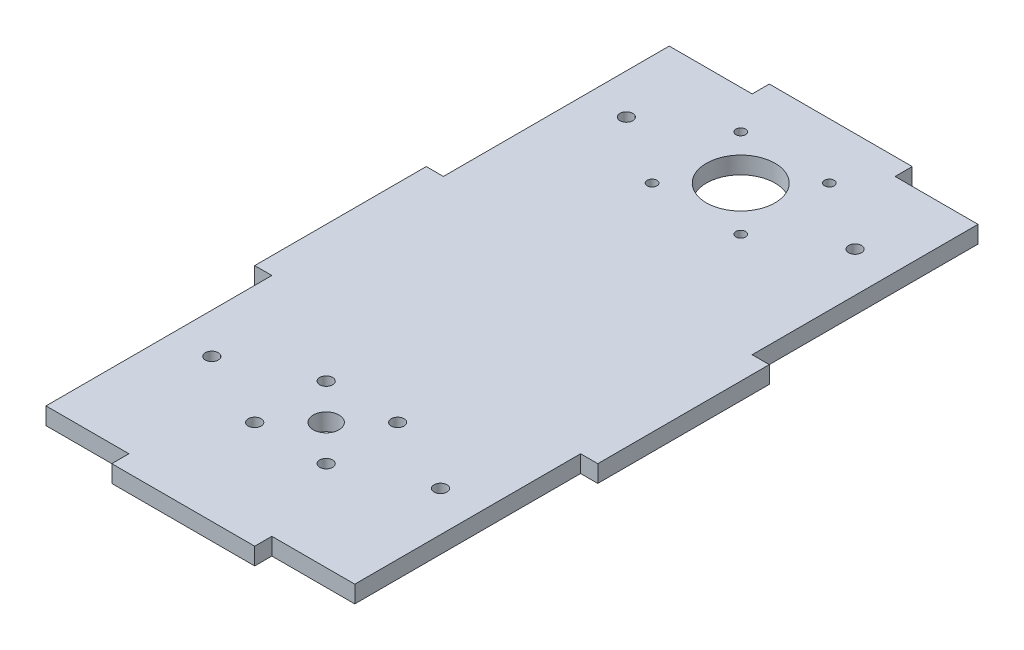
ISO-10303-21;
HEADER;
FILE_DESCRIPTION(('STEP AP214'),'2;1');
FILE_NAME('part.step','',(''),(''),'','','');
FILE_SCHEMA(('AUTOMOTIVE_DESIGN { 1 0 10303 214 1 1 1 1 }'));
ENDSEC;
DATA;
#1=APPLICATION_CONTEXT('core data for automotive mechanical design processes');
#2=APPLICATION_PROTOCOL_DEFINITION('international standard','automotive_design',2000,#1);
#3=PRODUCT_CONTEXT('',#1,'mechanical');
#4=PRODUCT('Part','Part','',(#3));
#5=PRODUCT_RELATED_PRODUCT_CATEGORY('part','',(#4));
#6=PRODUCT_DEFINITION_FORMATION('','',#4);
#7=PRODUCT_DEFINITION_CONTEXT('part definition',#1,'design');
#8=PRODUCT_DEFINITION('design','',#6,#7);
#9=PRODUCT_DEFINITION_SHAPE('','',#8);
#10=(LENGTH_UNIT() NAMED_UNIT(*) SI_UNIT(.MILLI.,.METRE.));
#11=(NAMED_UNIT(*) PLANE_ANGLE_UNIT() SI_UNIT($,.RADIAN.));
#12=(NAMED_UNIT(*) SI_UNIT($,.STERADIAN.) SOLID_ANGLE_UNIT());
#13=UNCERTAINTY_MEASURE_WITH_UNIT(LENGTH_MEASURE(1.E-05),#10,'distance_accuracy_value','');
#14=(GEOMETRIC_REPRESENTATION_CONTEXT(3) GLOBAL_UNCERTAINTY_ASSIGNED_CONTEXT((#13)) GLOBAL_UNIT_ASSIGNED_CONTEXT((#10,
#11,#12)) REPRESENTATION_CONTEXT('',''));
#15=CARTESIAN_POINT('',(0.,0.,0.));
#16=DIRECTION('',(0.,0.,1.));
#17=DIRECTION('',(1.,0.,0.));
#18=AXIS2_PLACEMENT_3D('',#15,#16,#17);
#19=CARTESIAN_POINT('',(0.,-3.,0.));
#20=DIRECTION('',(0.,1.,0.));
#21=DIRECTION('',(0.,0.,1.));
#22=AXIS2_PLACEMENT_3D('',#19,#20,#21);
#23=PLANE('',#22);
#24=CARTESIAN_POINT('',(-40.,-3.,-80.));
#25=DIRECTION('',(0.,1.,0.));
#26=DIRECTION('',(0.,0.,1.));
#27=AXIS2_PLACEMENT_3D('',#24,#25,#26);
#28=CIRCLE('',#27,2.25);
#29=CARTESIAN_POINT('',(-40.,-3.,-77.75));
#30=VERTEX_POINT('',#29);
#31=EDGE_CURVE('E454',#30,#30,#28,.T.);
#32=ORIENTED_EDGE('',*,*,#31,.T.);
#33=EDGE_LOOP('',(#32));
#34=FACE_BOUND('',#33,.T.);
#35=CARTESIAN_POINT('',(-40.,-3.,65.));
#36=DIRECTION('',(0.,1.,0.));
#37=DIRECTION('',(0.,0.,1.));
#38=AXIS2_PLACEMENT_3D('',#35,#36,#37);
#39=CIRCLE('',#38,2.25);
#40=CARTESIAN_POINT('',(-40.,-3.,67.25));
#41=VERTEX_POINT('',#40);
#42=EDGE_CURVE('E459',#41,#41,#39,.T.);
#43=ORIENTED_EDGE('',*,*,#42,.T.);
#44=EDGE_LOOP('',(#43));
#45=FACE_BOUND('',#44,.T.);
#46=CARTESIAN_POINT('',(40.,-3.,65.));
#47=DIRECTION('',(0.,1.,0.));
#48=DIRECTION('',(0.,0.,1.));
#49=AXIS2_PLACEMENT_3D('',#46,#47,#48);
#50=CIRCLE('',#49,2.25);
#51=CARTESIAN_POINT('',(40.,-3.,67.25));
#52=VERTEX_POINT('',#51);
#53=EDGE_CURVE('E465',#52,#52,#50,.T.);
#54=ORIENTED_EDGE('',*,*,#53,.T.);
#55=EDGE_LOOP('',(#54));
#56=FACE_BOUND('',#55,.T.);
#57=CARTESIAN_POINT('',(40.,-3.,-80.));
#58=DIRECTION('',(0.,1.,0.));
#59=DIRECTION('',(0.,0.,1.));
#60=AXIS2_PLACEMENT_3D('',#57,#58,#59);
#61=CIRCLE('',#60,2.25);
#62=CARTESIAN_POINT('',(40.,-3.,-77.75));
#63=VERTEX_POINT('',#62);
#64=EDGE_CURVE('E471',#63,#63,#61,.T.);
#65=ORIENTED_EDGE('',*,*,#64,.T.);
#66=EDGE_LOOP('',(#65));
#67=FACE_BOUND('',#66,.T.);
#68=CARTESIAN_POINT('',(-12.5,-3.,77.5));
#69=DIRECTION('',(0.,1.,0.));
#70=DIRECTION('',(0.,0.,1.));
#71=AXIS2_PLACEMENT_3D('',#68,#69,#70);
#72=CIRCLE('',#71,2.25);
#73=CARTESIAN_POINT('',(-12.5,-3.,79.75));
#74=VERTEX_POINT('',#73);
#75=EDGE_CURVE('E477',#74,#74,#72,.T.);
#76=ORIENTED_EDGE('',*,*,#75,.T.);
#77=EDGE_LOOP('',(#76));
#78=FACE_BOUND('',#77,.T.);
#79=CARTESIAN_POINT('',(-12.5,-3.,52.5));
#80=DIRECTION('',(0.,1.,0.));
#81=DIRECTION('',(0.,0.,1.));
#82=AXIS2_PLACEMENT_3D('',#79,#80,#81);
#83=CIRCLE('',#82,2.25);
#84=CARTESIAN_POINT('',(-12.5,-3.,54.75));
#85=VERTEX_POINT('',#84);
#86=EDGE_CURVE('E483',#85,#85,#83,.T.);
#87=ORIENTED_EDGE('',*,*,#86,.T.);
#88=EDGE_LOOP('',(#87));
#89=FACE_BOUND('',#88,.T.);
#90=CARTESIAN_POINT('',(12.5,-3.,52.5));
#91=DIRECTION('',(0.,1.,0.));
#92=DIRECTION('',(0.,0.,1.));
#93=AXIS2_PLACEMENT_3D('',#90,#91,#92);
#94=CIRCLE('',#93,2.25);
#95=CARTESIAN_POINT('',(12.5,-3.,54.75));
#96=VERTEX_POINT('',#95);
#97=EDGE_CURVE('E489',#96,#96,#94,.T.);
#98=ORIENTED_EDGE('',*,*,#97,.T.);
#99=EDGE_LOOP('',(#98));
#100=FACE_BOUND('',#99,.T.);
#101=CARTESIAN_POINT('',(12.5,-3.,77.5));
#102=DIRECTION('',(0.,1.,0.));
#103=DIRECTION('',(0.,0.,1.));
#104=AXIS2_PLACEMENT_3D('',#101,#102,#103);
#105=CIRCLE('',#104,2.25);
#106=CARTESIAN_POINT('',(12.5,-3.,79.75));
#107=VERTEX_POINT('',#106);
#108=EDGE_CURVE('E495',#107,#107,#105,.T.);
#109=ORIENTED_EDGE('',*,*,#108,.T.);
#110=EDGE_LOOP('',(#109));
#111=FACE_BOUND('',#110,.T.);
#112=DIRECTION('',(-1.,0.,0.));
#113=VECTOR('',#112,1.);
#114=CARTESIAN_POINT('',(25.,-3.,-109.));
#115=LINE('',#114,#113);
#116=CARTESIAN_POINT('',(54.,-3.,-109.));
#117=VERTEX_POINT('',#116);
#118=CARTESIAN_POINT('',(25.,-3.,-109.));
#119=VERTEX_POINT('',#118);
#120=EDGE_CURVE('E202',#117,#119,#115,.T.);
#121=ORIENTED_EDGE('',*,*,#120,.F.);
#122=DIRECTION('',(0.,0.,-1.));
#123=VECTOR('',#122,1.);
#124=CARTESIAN_POINT('',(54.,-3.,-30.));
#125=LINE('',#124,#123);
#126=CARTESIAN_POINT('',(54.,-3.,-30.));
#127=VERTEX_POINT('',#126);
#128=EDGE_CURVE('E120',#127,#117,#125,.T.);
#129=ORIENTED_EDGE('',*,*,#128,.F.);
#130=DIRECTION('',(-1.,0.,0.));
#131=VECTOR('',#130,1.);
#132=CARTESIAN_POINT('',(54.,-3.,-30.));
#133=LINE('',#132,#131);
#134=CARTESIAN_POINT('',(60.,-3.,-30.));
#135=VERTEX_POINT('',#134);
#136=EDGE_CURVE('E114',#135,#127,#133,.T.);
#137=ORIENTED_EDGE('',*,*,#136,.F.);
#138=DIRECTION('',(0.,0.,-1.));
#139=VECTOR('',#138,1.);
#140=CARTESIAN_POINT('',(60.,-3.,-30.));
#141=LINE('',#140,#139);
#142=CARTESIAN_POINT('',(60.,-3.,30.));
#143=VERTEX_POINT('',#142);
#144=EDGE_CURVE('E192',#143,#135,#141,.T.);
#145=ORIENTED_EDGE('',*,*,#144,.F.);
#146=DIRECTION('',(1.,0.,0.));
#147=VECTOR('',#146,1.);
#148=CARTESIAN_POINT('',(54.,-3.,30.));
#149=LINE('',#148,#147);
#150=CARTESIAN_POINT('',(54.,-3.,30.));
#151=VERTEX_POINT('',#150);
#152=EDGE_CURVE('E236',#151,#143,#149,.T.);
#153=ORIENTED_EDGE('',*,*,#152,.F.);
#154=DIRECTION('',(0.,0.,-1.));
#155=VECTOR('',#154,1.);
#156=CARTESIAN_POINT('',(54.,-3.,109.));
#157=LINE('',#156,#155);
#158=CARTESIAN_POINT('',(54.,-3.,109.));
#159=VERTEX_POINT('',#158);
#160=EDGE_CURVE('E234',#159,#151,#157,.T.);
#161=ORIENTED_EDGE('',*,*,#160,.F.);
#162=DIRECTION('',(1.,0.,0.));
#163=VECTOR('',#162,1.);
#164=CARTESIAN_POINT('',(25.,-3.,109.));
#165=LINE('',#164,#163);
#166=CARTESIAN_POINT('',(25.,-3.,109.));
#167=VERTEX_POINT('',#166);
#168=EDGE_CURVE('E232',#167,#159,#165,.T.);
#169=ORIENTED_EDGE('',*,*,#168,.F.);
#170=DIRECTION('',(0.,0.,-1.));
#171=VECTOR('',#170,1.);
#172=CARTESIAN_POINT('',(25.,-3.,109.));
#173=LINE('',#172,#171);
#174=CARTESIAN_POINT('',(25.,-3.,115.));
#175=VERTEX_POINT('',#174);
#176=EDGE_CURVE('E230',#175,#167,#173,.T.);
#177=ORIENTED_EDGE('',*,*,#176,.F.);
#178=DIRECTION('',(1.,0.,0.));
#179=VECTOR('',#178,1.);
#180=CARTESIAN_POINT('',(-24.9999999999999,-3.,115.));
#181=LINE('',#180,#179);
#182=CARTESIAN_POINT('',(-24.9999999999999,-3.,115.));
#183=VERTEX_POINT('',#182);
#184=EDGE_CURVE('E228',#183,#175,#181,.T.);
#185=ORIENTED_EDGE('',*,*,#184,.F.);
#186=DIRECTION('',(0.,0.,1.));
#187=VECTOR('',#186,1.);
#188=CARTESIAN_POINT('',(-25.,-3.,109.));
#189=LINE('',#188,#187);
#190=CARTESIAN_POINT('',(-25.,-3.,109.));
#191=VERTEX_POINT('',#190);
#192=EDGE_CURVE('E226',#191,#183,#189,.T.);
#193=ORIENTED_EDGE('',*,*,#192,.F.);
#194=DIRECTION('',(1.,0.,0.));
#195=VECTOR('',#194,1.);
#196=CARTESIAN_POINT('',(-54.,-3.,109.));
#197=LINE('',#196,#195);
#198=CARTESIAN_POINT('',(-54.,-3.,109.));
#199=VERTEX_POINT('',#198);
#200=EDGE_CURVE('E224',#199,#191,#197,.T.);
#201=ORIENTED_EDGE('',*,*,#200,.F.);
#202=DIRECTION('',(0.,0.,1.));
#203=VECTOR('',#202,1.);
#204=CARTESIAN_POINT('',(-54.,-3.,109.));
#205=LINE('',#204,#203);
#206=CARTESIAN_POINT('',(-54.,-3.,30.));
#207=VERTEX_POINT('',#206);
#208=EDGE_CURVE('E222',#207,#199,#205,.T.);
#209=ORIENTED_EDGE('',*,*,#208,.F.);
#210=DIRECTION('',(1.,0.,0.));
#211=VECTOR('',#210,1.);
#212=CARTESIAN_POINT('',(-54.,-3.,30.));
#213=LINE('',#212,#211);
#214=CARTESIAN_POINT('',(-60.,-3.,30.));
#215=VERTEX_POINT('',#214);
#216=EDGE_CURVE('E220',#215,#207,#213,.T.);
#217=ORIENTED_EDGE('',*,*,#216,.F.);
#218=DIRECTION('',(0.,0.,1.));
#219=VECTOR('',#218,1.);
#220=CARTESIAN_POINT('',(-60.,-3.,-30.));
#221=LINE('',#220,#219);
#222=CARTESIAN_POINT('',(-60.,-3.,-30.));
#223=VERTEX_POINT('',#222);
#224=EDGE_CURVE('E218',#223,#215,#221,.T.);
#225=ORIENTED_EDGE('',*,*,#224,.F.);
#226=DIRECTION('',(-1.,0.,0.));
#227=VECTOR('',#226,1.);
#228=CARTESIAN_POINT('',(-54.,-3.,-30.));
#229=LINE('',#228,#227);
#230=CARTESIAN_POINT('',(-54.,-3.,-30.));
#231=VERTEX_POINT('',#230);
#232=EDGE_CURVE('E216',#231,#223,#229,.T.);
#233=ORIENTED_EDGE('',*,*,#232,.F.);
#234=DIRECTION('',(0.,0.,1.));
#235=VECTOR('',#234,1.);
#236=CARTESIAN_POINT('',(-54.,-3.,-30.));
#237=LINE('',#236,#235);
#238=CARTESIAN_POINT('',(-54.,-3.,-109.));
#239=VERTEX_POINT('',#238);
#240=EDGE_CURVE('E214',#239,#231,#237,.T.);
#241=ORIENTED_EDGE('',*,*,#240,.F.);
#242=DIRECTION('',(-1.,0.,0.));
#243=VECTOR('',#242,1.);
#244=CARTESIAN_POINT('',(-54.,-3.,-109.));
#245=LINE('',#244,#243);
#246=CARTESIAN_POINT('',(-25.,-3.,-109.));
#247=VERTEX_POINT('',#246);
#248=EDGE_CURVE('E212',#247,#239,#245,.T.);
#249=ORIENTED_EDGE('',*,*,#248,.F.);
#250=DIRECTION('',(0.,0.,1.));
#251=VECTOR('',#250,1.);
#252=CARTESIAN_POINT('',(-25.,-3.,-109.));
#253=LINE('',#252,#251);
#254=CARTESIAN_POINT('',(-25.,-3.,-115.));
#255=VERTEX_POINT('',#254);
#256=EDGE_CURVE('E210',#255,#247,#253,.T.);
#257=ORIENTED_EDGE('',*,*,#256,.F.);
#258=DIRECTION('',(-1.,0.,0.));
#259=VECTOR('',#258,1.);
#260=CARTESIAN_POINT('',(-25.,-3.,-115.));
#261=LINE('',#260,#259);
#262=CARTESIAN_POINT('',(25.,-3.,-115.));
#263=VERTEX_POINT('',#262);
#264=EDGE_CURVE('E208',#263,#255,#261,.T.);
#265=ORIENTED_EDGE('',*,*,#264,.F.);
#266=DIRECTION('',(0.,0.,-1.));
#267=VECTOR('',#266,1.);
#268=CARTESIAN_POINT('',(25.,-3.,-109.));
#269=LINE('',#268,#267);
#270=EDGE_CURVE('E205',#119,#263,#269,.T.);
#271=ORIENTED_EDGE('',*,*,#270,.F.);
#272=EDGE_LOOP('',(#121,#129,#137,#145,#153,#161,#169,#177,#185,#193,#201,#209,#217,#225,#233,
#241,#249,#257,#265,#271));
#273=FACE_BOUND('',#272,.T.);
#274=CARTESIAN_POINT('',(0.,-3.,65.));
#275=DIRECTION('',(0.,1.,0.));
#276=DIRECTION('',(0.,0.,1.));
#277=AXIS2_PLACEMENT_3D('',#274,#275,#276);
#278=CIRCLE('',#277,4.5);
#279=CARTESIAN_POINT('',(0.,-3.,69.5));
#280=VERTEX_POINT('',#279);
#281=EDGE_CURVE('E502',#280,#280,#278,.T.);
#282=ORIENTED_EDGE('',*,*,#281,.T.);
#283=EDGE_LOOP('',(#282));
#284=FACE_BOUND('',#283,.T.);
#285=CARTESIAN_POINT('',(0.,-3.,-80.));
#286=DIRECTION('',(0.,1.,0.));
#287=DIRECTION('',(0.,0.,1.));
#288=AXIS2_PLACEMENT_3D('',#285,#286,#287);
#289=CIRCLE('',#288,12.);
#290=CARTESIAN_POINT('',(0.,-3.,-68.));
#291=VERTEX_POINT('',#290);
#292=EDGE_CURVE('E498',#291,#291,#289,.T.);
#293=ORIENTED_EDGE('',*,*,#292,.T.);
#294=EDGE_LOOP('',(#293));
#295=FACE_BOUND('',#294,.T.);
#296=CARTESIAN_POINT('',(-15.5,-3.,-64.5));
#297=DIRECTION('',(0.,-1.,0.));
#298=DIRECTION('',(0.,0.,-1.));
#299=AXIS2_PLACEMENT_3D('',#296,#297,#298);
#300=CIRCLE('',#299,1.69999999999999);
#301=CARTESIAN_POINT('',(-15.5,-3.,-66.2));
#302=VERTEX_POINT('',#301);
#303=EDGE_CURVE('E445',#302,#302,#300,.T.);
#304=ORIENTED_EDGE('',*,*,#303,.F.);
#305=EDGE_LOOP('',(#304));
#306=FACE_BOUND('',#305,.T.);
#307=CARTESIAN_POINT('',(-15.5,-3.,-95.5));
#308=DIRECTION('',(0.,-1.,0.));
#309=DIRECTION('',(0.,0.,-1.));
#310=AXIS2_PLACEMENT_3D('',#307,#308,#309);
#311=CIRCLE('',#310,1.69999999999999);
#312=CARTESIAN_POINT('',(-15.5,-3.,-97.2));
#313=VERTEX_POINT('',#312);
#314=EDGE_CURVE('E439',#313,#313,#311,.T.);
#315=ORIENTED_EDGE('',*,*,#314,.F.);
#316=EDGE_LOOP('',(#315));
#317=FACE_BOUND('',#316,.T.);
#318=CARTESIAN_POINT('',(15.5,-3.,-95.5));
#319=DIRECTION('',(0.,-1.,0.));
#320=DIRECTION('',(0.,0.,-1.));
#321=AXIS2_PLACEMENT_3D('',#318,#319,#320);
#322=CIRCLE('',#321,1.69999999999999);
#323=CARTESIAN_POINT('',(15.5,-3.,-97.2));
#324=VERTEX_POINT('',#323);
#325=EDGE_CURVE('E430',#324,#324,#322,.T.);
#326=ORIENTED_EDGE('',*,*,#325,.F.);
#327=EDGE_LOOP('',(#326));
#328=FACE_BOUND('',#327,.T.);
#329=CARTESIAN_POINT('',(15.5,-3.,-64.5));
#330=DIRECTION('',(0.,-1.,0.));
#331=DIRECTION('',(0.,0.,-1.));
#332=AXIS2_PLACEMENT_3D('',#329,#330,#331);
#333=CIRCLE('',#332,1.69999999999999);
#334=CARTESIAN_POINT('',(15.5,-3.,-66.2));
#335=VERTEX_POINT('',#334);
#336=EDGE_CURVE('E426',#335,#335,#333,.T.);
#337=ORIENTED_EDGE('',*,*,#336,.F.);
#338=EDGE_LOOP('',(#337));
#339=FACE_BOUND('',#338,.T.);
#340=ADVANCED_FACE('F32',(#34,#45,#56,#67,#78,#89,#100,#111,#273,#284,#295,#306,#317,#328,#339),
#23,.F.);
#341=CARTESIAN_POINT('',(0.,3.,0.));
#342=DIRECTION('',(0.,1.,0.));
#343=DIRECTION('',(0.,0.,1.));
#344=AXIS2_PLACEMENT_3D('',#341,#342,#343);
#345=PLANE('',#344);
#346=CARTESIAN_POINT('',(15.5,3.,-64.5));
#347=DIRECTION('',(0.,1.,0.));
#348=DIRECTION('',(0.,0.,1.));
#349=AXIS2_PLACEMENT_3D('',#346,#347,#348);
#350=CIRCLE('',#349,1.69999999999999);
#351=CARTESIAN_POINT('',(15.5,3.,-62.8));
#352=VERTEX_POINT('',#351);
#353=EDGE_CURVE('E429',#352,#352,#350,.T.);
#354=ORIENTED_EDGE('',*,*,#353,.F.);
#355=EDGE_LOOP('',(#354));
#356=FACE_BOUND('',#355,.T.);
#357=CARTESIAN_POINT('',(15.5,3.,-95.5));
#358=DIRECTION('',(0.,1.,0.));
#359=DIRECTION('',(0.,0.,1.));
#360=AXIS2_PLACEMENT_3D('',#357,#358,#359);
#361=CIRCLE('',#360,1.69999999999999);
#362=CARTESIAN_POINT('',(15.5,3.,-93.8));
#363=VERTEX_POINT('',#362);
#364=EDGE_CURVE('E433',#363,#363,#361,.T.);
#365=ORIENTED_EDGE('',*,*,#364,.F.);
#366=EDGE_LOOP('',(#365));
#367=FACE_BOUND('',#366,.T.);
#368=CARTESIAN_POINT('',(-15.5,3.,-95.5));
#369=DIRECTION('',(0.,1.,0.));
#370=DIRECTION('',(0.,0.,1.));
#371=AXIS2_PLACEMENT_3D('',#368,#369,#370);
#372=CIRCLE('',#371,1.69999999999999);
#373=CARTESIAN_POINT('',(-15.5,3.,-93.8));
#374=VERTEX_POINT('',#373);
#375=EDGE_CURVE('E442',#374,#374,#372,.T.);
#376=ORIENTED_EDGE('',*,*,#375,.F.);
#377=EDGE_LOOP('',(#376));
#378=FACE_BOUND('',#377,.T.);
#379=CARTESIAN_POINT('',(-15.5,3.,-64.5));
#380=DIRECTION('',(0.,1.,0.));
#381=DIRECTION('',(0.,0.,1.));
#382=AXIS2_PLACEMENT_3D('',#379,#380,#381);
#383=CIRCLE('',#382,1.69999999999999);
#384=CARTESIAN_POINT('',(-15.5,3.,-62.8));
#385=VERTEX_POINT('',#384);
#386=EDGE_CURVE('E448',#385,#385,#383,.T.);
#387=ORIENTED_EDGE('',*,*,#386,.F.);
#388=EDGE_LOOP('',(#387));
#389=FACE_BOUND('',#388,.T.);
#390=CARTESIAN_POINT('',(-40.,3.,-80.));
#391=DIRECTION('',(0.,1.,0.));
#392=DIRECTION('',(0.,0.,1.));
#393=AXIS2_PLACEMENT_3D('',#390,#391,#392);
#394=CIRCLE('',#393,2.25);
#395=CARTESIAN_POINT('',(-40.,3.,-77.75));
#396=VERTEX_POINT('',#395);
#397=EDGE_CURVE('E451',#396,#396,#394,.T.);
#398=ORIENTED_EDGE('',*,*,#397,.F.);
#399=EDGE_LOOP('',(#398));
#400=FACE_BOUND('',#399,.T.);
#401=CARTESIAN_POINT('',(-40.,3.,65.));
#402=DIRECTION('',(0.,1.,0.));
#403=DIRECTION('',(0.,0.,1.));
#404=AXIS2_PLACEMENT_3D('',#401,#402,#403);
#405=CIRCLE('',#404,2.25);
#406=CARTESIAN_POINT('',(-40.,3.,67.25));
#407=VERTEX_POINT('',#406);
#408=EDGE_CURVE('E456',#407,#407,#405,.T.);
#409=ORIENTED_EDGE('',*,*,#408,.F.);
#410=EDGE_LOOP('',(#409));
#411=FACE_BOUND('',#410,.T.);
#412=CARTESIAN_POINT('',(40.,3.,65.));
#413=DIRECTION('',(0.,1.,0.));
#414=DIRECTION('',(0.,0.,1.));
#415=AXIS2_PLACEMENT_3D('',#412,#413,#414);
#416=CIRCLE('',#415,2.25);
#417=CARTESIAN_POINT('',(40.,3.,67.25));
#418=VERTEX_POINT('',#417);
#419=EDGE_CURVE('E462',#418,#418,#416,.T.);
#420=ORIENTED_EDGE('',*,*,#419,.F.);
#421=EDGE_LOOP('',(#420));
#422=FACE_BOUND('',#421,.T.);
#423=CARTESIAN_POINT('',(40.,3.,-80.));
#424=DIRECTION('',(0.,1.,0.));
#425=DIRECTION('',(0.,0.,1.));
#426=AXIS2_PLACEMENT_3D('',#423,#424,#425);
#427=CIRCLE('',#426,2.25);
#428=CARTESIAN_POINT('',(40.,3.,-77.75));
#429=VERTEX_POINT('',#428);
#430=EDGE_CURVE('E468',#429,#429,#427,.T.);
#431=ORIENTED_EDGE('',*,*,#430,.F.);
#432=EDGE_LOOP('',(#431));
#433=FACE_BOUND('',#432,.T.);
#434=CARTESIAN_POINT('',(-12.5,3.,77.5));
#435=DIRECTION('',(0.,1.,0.));
#436=DIRECTION('',(0.,0.,1.));
#437=AXIS2_PLACEMENT_3D('',#434,#435,#436);
#438=CIRCLE('',#437,2.25);
#439=CARTESIAN_POINT('',(-12.5,3.,79.75));
#440=VERTEX_POINT('',#439);
#441=EDGE_CURVE('E474',#440,#440,#438,.T.);
#442=ORIENTED_EDGE('',*,*,#441,.F.);
#443=EDGE_LOOP('',(#442));
#444=FACE_BOUND('',#443,.T.);
#445=CARTESIAN_POINT('',(-12.5,3.,52.5));
#446=DIRECTION('',(0.,1.,0.));
#447=DIRECTION('',(0.,0.,1.));
#448=AXIS2_PLACEMENT_3D('',#445,#446,#447);
#449=CIRCLE('',#448,2.25);
#450=CARTESIAN_POINT('',(-12.5,3.,54.75));
#451=VERTEX_POINT('',#450);
#452=EDGE_CURVE('E480',#451,#451,#449,.T.);
#453=ORIENTED_EDGE('',*,*,#452,.F.);
#454=EDGE_LOOP('',(#453));
#455=FACE_BOUND('',#454,.T.);
#456=CARTESIAN_POINT('',(12.5,3.,52.5));
#457=DIRECTION('',(0.,1.,0.));
#458=DIRECTION('',(0.,0.,1.));
#459=AXIS2_PLACEMENT_3D('',#456,#457,#458);
#460=CIRCLE('',#459,2.25);
#461=CARTESIAN_POINT('',(12.5,3.,54.75));
#462=VERTEX_POINT('',#461);
#463=EDGE_CURVE('E486',#462,#462,#460,.T.);
#464=ORIENTED_EDGE('',*,*,#463,.F.);
#465=EDGE_LOOP('',(#464));
#466=FACE_BOUND('',#465,.T.);
#467=CARTESIAN_POINT('',(12.5,3.,77.5));
#468=DIRECTION('',(0.,1.,0.));
#469=DIRECTION('',(0.,0.,1.));
#470=AXIS2_PLACEMENT_3D('',#467,#468,#469);
#471=CIRCLE('',#470,2.25);
#472=CARTESIAN_POINT('',(12.5,3.,79.75));
#473=VERTEX_POINT('',#472);
#474=EDGE_CURVE('E492',#473,#473,#471,.T.);
#475=ORIENTED_EDGE('',*,*,#474,.F.);
#476=EDGE_LOOP('',(#475));
#477=FACE_BOUND('',#476,.T.);
#478=CARTESIAN_POINT('',(0.,3.,65.));
#479=DIRECTION('',(0.,1.,0.));
#480=DIRECTION('',(0.,0.,1.));
#481=AXIS2_PLACEMENT_3D('',#478,#479,#480);
#482=CIRCLE('',#481,4.5);
#483=CARTESIAN_POINT('',(0.,3.,69.5));
#484=VERTEX_POINT('',#483);
#485=EDGE_CURVE('E206',#484,#484,#482,.T.);
#486=ORIENTED_EDGE('',*,*,#485,.F.);
#487=EDGE_LOOP('',(#486));
#488=FACE_BOUND('',#487,.T.);
#489=DIRECTION('',(-1.,0.,0.));
#490=VECTOR('',#489,1.);
#491=CARTESIAN_POINT('',(25.,3.,-109.));
#492=LINE('',#491,#490);
#493=CARTESIAN_POINT('',(54.,3.,-109.));
#494=VERTEX_POINT('',#493);
#495=CARTESIAN_POINT('',(25.,3.,-109.));
#496=VERTEX_POINT('',#495);
#497=EDGE_CURVE('E241',#494,#496,#492,.T.);
#498=ORIENTED_EDGE('',*,*,#497,.T.);
#499=DIRECTION('',(0.,0.,-1.));
#500=VECTOR('',#499,1.);
#501=CARTESIAN_POINT('',(25.,3.,-109.));
#502=LINE('',#501,#500);
#503=CARTESIAN_POINT('',(25.,3.,-115.));
#504=VERTEX_POINT('',#503);
#505=EDGE_CURVE('E128',#496,#504,#502,.T.);
#506=ORIENTED_EDGE('',*,*,#505,.T.);
#507=DIRECTION('',(-1.,0.,0.));
#508=VECTOR('',#507,1.);
#509=CARTESIAN_POINT('',(-25.,3.,-115.));
#510=LINE('',#509,#508);
#511=CARTESIAN_POINT('',(-25.,3.,-115.));
#512=VERTEX_POINT('',#511);
#513=EDGE_CURVE('E292',#504,#512,#510,.T.);
#514=ORIENTED_EDGE('',*,*,#513,.T.);
#515=DIRECTION('',(0.,0.,1.));
#516=VECTOR('',#515,1.);
#517=CARTESIAN_POINT('',(-25.,3.,-109.));
#518=LINE('',#517,#516);
#519=CARTESIAN_POINT('',(-25.,3.,-109.));
#520=VERTEX_POINT('',#519);
#521=EDGE_CURVE('E310',#512,#520,#518,.T.);
#522=ORIENTED_EDGE('',*,*,#521,.T.);
#523=DIRECTION('',(-1.,0.,0.));
#524=VECTOR('',#523,1.);
#525=CARTESIAN_POINT('',(-54.,3.,-109.));
#526=LINE('',#525,#524);
#527=CARTESIAN_POINT('',(-54.,3.,-109.));
#528=VERTEX_POINT('',#527);
#529=EDGE_CURVE('E307',#520,#528,#526,.T.);
#530=ORIENTED_EDGE('',*,*,#529,.T.);
#531=DIRECTION('',(0.,0.,1.));
#532=VECTOR('',#531,1.);
#533=CARTESIAN_POINT('',(-54.,3.,-30.));
#534=LINE('',#533,#532);
#535=CARTESIAN_POINT('',(-54.,3.,-30.));
#536=VERTEX_POINT('',#535);
#537=EDGE_CURVE('E309',#528,#536,#534,.T.);
#538=ORIENTED_EDGE('',*,*,#537,.T.);
#539=DIRECTION('',(-1.,0.,0.));
#540=VECTOR('',#539,1.);
#541=CARTESIAN_POINT('',(-54.,3.,-30.));
#542=LINE('',#541,#540);
#543=CARTESIAN_POINT('',(-60.,3.,-30.));
#544=VERTEX_POINT('',#543);
#545=EDGE_CURVE('E312',#536,#544,#542,.T.);
#546=ORIENTED_EDGE('',*,*,#545,.T.);
#547=DIRECTION('',(0.,0.,1.));
#548=VECTOR('',#547,1.);
#549=CARTESIAN_POINT('',(-60.,3.,-30.));
#550=LINE('',#549,#548);
#551=CARTESIAN_POINT('',(-60.,3.,30.));
#552=VERTEX_POINT('',#551);
#553=EDGE_CURVE('E318',#544,#552,#550,.T.);
#554=ORIENTED_EDGE('',*,*,#553,.T.);
#555=DIRECTION('',(1.,0.,0.));
#556=VECTOR('',#555,1.);
#557=CARTESIAN_POINT('',(-54.,3.,30.));
#558=LINE('',#557,#556);
#559=CARTESIAN_POINT('',(-54.,3.,30.));
#560=VERTEX_POINT('',#559);
#561=EDGE_CURVE('E320',#552,#560,#558,.T.);
#562=ORIENTED_EDGE('',*,*,#561,.T.);
#563=DIRECTION('',(0.,0.,1.));
#564=VECTOR('',#563,1.);
#565=CARTESIAN_POINT('',(-54.,3.,109.));
#566=LINE('',#565,#564);
#567=CARTESIAN_POINT('',(-54.,3.,109.));
#568=VERTEX_POINT('',#567);
#569=EDGE_CURVE('E322',#560,#568,#566,.T.);
#570=ORIENTED_EDGE('',*,*,#569,.T.);
#571=DIRECTION('',(1.,0.,0.));
#572=VECTOR('',#571,1.);
#573=CARTESIAN_POINT('',(-54.,3.,109.));
#574=LINE('',#573,#572);
#575=CARTESIAN_POINT('',(-25.,3.,109.));
#576=VERTEX_POINT('',#575);
#577=EDGE_CURVE('E324',#568,#576,#574,.T.);
#578=ORIENTED_EDGE('',*,*,#577,.T.);
#579=DIRECTION('',(0.,0.,1.));
#580=VECTOR('',#579,1.);
#581=CARTESIAN_POINT('',(-25.,3.,109.));
#582=LINE('',#581,#580);
#583=CARTESIAN_POINT('',(-24.9999999999999,3.,115.));
#584=VERTEX_POINT('',#583);
#585=EDGE_CURVE('E326',#576,#584,#582,.T.);
#586=ORIENTED_EDGE('',*,*,#585,.T.);
#587=DIRECTION('',(1.,0.,0.));
#588=VECTOR('',#587,1.);
#589=CARTESIAN_POINT('',(-24.9999999999999,3.,115.));
#590=LINE('',#589,#588);
#591=CARTESIAN_POINT('',(25.,3.,115.));
#592=VERTEX_POINT('',#591);
#593=EDGE_CURVE('E328',#584,#592,#590,.T.);
#594=ORIENTED_EDGE('',*,*,#593,.T.);
#595=DIRECTION('',(0.,0.,-1.));
#596=VECTOR('',#595,1.);
#597=CARTESIAN_POINT('',(25.,3.,109.));
#598=LINE('',#597,#596);
#599=CARTESIAN_POINT('',(25.,3.,109.));
#600=VERTEX_POINT('',#599);
#601=EDGE_CURVE('E330',#592,#600,#598,.T.);
#602=ORIENTED_EDGE('',*,*,#601,.T.);
#603=DIRECTION('',(1.,0.,0.));
#604=VECTOR('',#603,1.);
#605=CARTESIAN_POINT('',(25.,3.,109.));
#606=LINE('',#605,#604);
#607=CARTESIAN_POINT('',(54.,3.,109.));
#608=VERTEX_POINT('',#607);
#609=EDGE_CURVE('E332',#600,#608,#606,.T.);
#610=ORIENTED_EDGE('',*,*,#609,.T.);
#611=DIRECTION('',(0.,0.,-1.));
#612=VECTOR('',#611,1.);
#613=CARTESIAN_POINT('',(54.,3.,109.));
#614=LINE('',#613,#612);
#615=CARTESIAN_POINT('',(54.,3.,30.));
#616=VERTEX_POINT('',#615);
#617=EDGE_CURVE('E334',#608,#616,#614,.T.);
#618=ORIENTED_EDGE('',*,*,#617,.T.);
#619=DIRECTION('',(1.,0.,0.));
#620=VECTOR('',#619,1.);
#621=CARTESIAN_POINT('',(54.,3.,30.));
#622=LINE('',#621,#620);
#623=CARTESIAN_POINT('',(60.,3.,30.));
#624=VERTEX_POINT('',#623);
#625=EDGE_CURVE('E184',#616,#624,#622,.T.);
#626=ORIENTED_EDGE('',*,*,#625,.T.);
#627=DIRECTION('',(0.,0.,-1.));
#628=VECTOR('',#627,1.);
#629=CARTESIAN_POINT('',(60.,3.,-30.));
#630=LINE('',#629,#628);
#631=CARTESIAN_POINT('',(60.,3.,-30.));
#632=VERTEX_POINT('',#631);
#633=EDGE_CURVE('E177',#624,#632,#630,.T.);
#634=ORIENTED_EDGE('',*,*,#633,.T.);
#635=DIRECTION('',(-1.,0.,0.));
#636=VECTOR('',#635,1.);
#637=CARTESIAN_POINT('',(54.,3.,-30.));
#638=LINE('',#637,#636);
#639=CARTESIAN_POINT('',(54.,3.,-30.));
#640=VERTEX_POINT('',#639);
#641=EDGE_CURVE('E182',#632,#640,#638,.T.);
#642=ORIENTED_EDGE('',*,*,#641,.T.);
#643=DIRECTION('',(0.,0.,-1.));
#644=VECTOR('',#643,1.);
#645=CARTESIAN_POINT('',(54.,3.,-30.));
#646=LINE('',#645,#644);
#647=EDGE_CURVE('E49',#640,#494,#646,.T.);
#648=ORIENTED_EDGE('',*,*,#647,.T.);
#649=EDGE_LOOP('',(#498,#506,#514,#522,#530,#538,#546,#554,#562,#570,#578,#586,#594,#602,#610,
#618,#626,#634,#642,#648));
#650=FACE_BOUND('',#649,.T.);
#651=CARTESIAN_POINT('',(0.,3.,-80.));
#652=DIRECTION('',(0.,1.,0.));
#653=DIRECTION('',(0.,0.,1.));
#654=AXIS2_PLACEMENT_3D('',#651,#652,#653);
#655=CIRCLE('',#654,12.);
#656=CARTESIAN_POINT('',(0.,3.,-68.));
#657=VERTEX_POINT('',#656);
#658=EDGE_CURVE('E499',#657,#657,#655,.T.);
#659=ORIENTED_EDGE('',*,*,#658,.F.);
#660=EDGE_LOOP('',(#659));
#661=FACE_BOUND('',#660,.T.);
#662=ADVANCED_FACE('F179',(#356,#367,#378,#389,#400,#411,#422,#433,#444,#455,#466,#477,#488,
#650,#661),#345,.T.);
#663=CARTESIAN_POINT('',(25.,3.,-109.));
#664=DIRECTION('',(0.,0.,1.));
#665=DIRECTION('',(1.,0.,0.));
#666=AXIS2_PLACEMENT_3D('',#663,#664,#665);
#667=PLANE('',#666);
#668=ORIENTED_EDGE('',*,*,#120,.T.);
#669=DIRECTION('',(0.,-1.,0.));
#670=VECTOR('',#669,1.);
#671=CARTESIAN_POINT('',(25.,3.,-109.));
#672=LINE('',#671,#670);
#673=EDGE_CURVE('E11',#496,#119,#672,.T.);
#674=ORIENTED_EDGE('',*,*,#673,.F.);
#675=ORIENTED_EDGE('',*,*,#497,.F.);
#676=DIRECTION('',(0.,-1.,0.));
#677=VECTOR('',#676,1.);
#678=CARTESIAN_POINT('',(54.,3.,-109.));
#679=LINE('',#678,#677);
#680=EDGE_CURVE('E198',#494,#117,#679,.T.);
#681=ORIENTED_EDGE('',*,*,#680,.T.);
#682=EDGE_LOOP('',(#668,#674,#675,#681));
#683=FACE_BOUND('',#682,.T.);
#684=ADVANCED_FACE('F34',(#683),#667,.F.);
#685=CARTESIAN_POINT('',(25.,3.,-109.));
#686=DIRECTION('',(-1.,0.,0.));
#687=DIRECTION('',(0.,0.,1.));
#688=AXIS2_PLACEMENT_3D('',#685,#686,#687);
#689=PLANE('',#688);
#690=ORIENTED_EDGE('',*,*,#270,.T.);
#691=DIRECTION('',(0.,-1.,0.));
#692=VECTOR('',#691,1.);
#693=CARTESIAN_POINT('',(25.,3.,-115.));
#694=LINE('',#693,#692);
#695=EDGE_CURVE('E41',#504,#263,#694,.T.);
#696=ORIENTED_EDGE('',*,*,#695,.F.);
#697=ORIENTED_EDGE('',*,*,#505,.F.);
#698=ORIENTED_EDGE('',*,*,#673,.T.);
#699=EDGE_LOOP('',(#690,#696,#697,#698));
#700=FACE_BOUND('',#699,.T.);
#701=ADVANCED_FACE('F784',(#700),#689,.F.);
#702=CARTESIAN_POINT('',(-25.,3.,-115.));
#703=DIRECTION('',(0.,0.,1.));
#704=DIRECTION('',(1.,0.,0.));
#705=AXIS2_PLACEMENT_3D('',#702,#703,#704);
#706=PLANE('',#705);
#707=ORIENTED_EDGE('',*,*,#264,.T.);
#708=DIRECTION('',(0.,-1.,0.));
#709=VECTOR('',#708,1.);
#710=CARTESIAN_POINT('',(-25.,3.,-115.));
#711=LINE('',#710,#709);
#712=EDGE_CURVE('E284',#512,#255,#711,.T.);
#713=ORIENTED_EDGE('',*,*,#712,.F.);
#714=ORIENTED_EDGE('',*,*,#513,.F.);
#715=ORIENTED_EDGE('',*,*,#695,.T.);
#716=EDGE_LOOP('',(#707,#713,#714,#715));
#717=FACE_BOUND('',#716,.T.);
#718=ADVANCED_FACE('F290',(#717),#706,.F.);
#719=CARTESIAN_POINT('',(-25.,3.,-109.));
#720=DIRECTION('',(1.,0.,0.));
#721=DIRECTION('',(0.,0.,-1.));
#722=AXIS2_PLACEMENT_3D('',#719,#720,#721);
#723=PLANE('',#722);
#724=ORIENTED_EDGE('',*,*,#256,.T.);
#725=DIRECTION('',(0.,-1.,0.));
#726=VECTOR('',#725,1.);
#727=CARTESIAN_POINT('',(-25.,3.,-109.));
#728=LINE('',#727,#726);
#729=EDGE_CURVE('E281',#520,#247,#728,.T.);
#730=ORIENTED_EDGE('',*,*,#729,.F.);
#731=ORIENTED_EDGE('',*,*,#521,.F.);
#732=ORIENTED_EDGE('',*,*,#712,.T.);
#733=EDGE_LOOP('',(#724,#730,#731,#732));
#734=FACE_BOUND('',#733,.T.);
#735=ADVANCED_FACE('F301',(#734),#723,.F.);
#736=CARTESIAN_POINT('',(-54.,3.,-109.));
#737=DIRECTION('',(0.,0.,1.));
#738=DIRECTION('',(1.,0.,0.));
#739=AXIS2_PLACEMENT_3D('',#736,#737,#738);
#740=PLANE('',#739);
#741=ORIENTED_EDGE('',*,*,#248,.T.);
#742=DIRECTION('',(0.,-1.,0.));
#743=VECTOR('',#742,1.);
#744=CARTESIAN_POINT('',(-54.,3.,-109.));
#745=LINE('',#744,#743);
#746=EDGE_CURVE('E278',#528,#239,#745,.T.);
#747=ORIENTED_EDGE('',*,*,#746,.F.);
#748=ORIENTED_EDGE('',*,*,#529,.F.);
#749=ORIENTED_EDGE('',*,*,#729,.T.);
#750=EDGE_LOOP('',(#741,#747,#748,#749));
#751=FACE_BOUND('',#750,.T.);
#752=ADVANCED_FACE('F305',(#751),#740,.F.);
#753=CARTESIAN_POINT('',(-54.,3.,-30.));
#754=DIRECTION('',(1.,0.,0.));
#755=DIRECTION('',(0.,0.,-1.));
#756=AXIS2_PLACEMENT_3D('',#753,#754,#755);
#757=PLANE('',#756);
#758=ORIENTED_EDGE('',*,*,#240,.T.);
#759=DIRECTION('',(0.,-1.,0.));
#760=VECTOR('',#759,1.);
#761=CARTESIAN_POINT('',(-54.,3.,-30.));
#762=LINE('',#761,#760);
#763=EDGE_CURVE('E275',#536,#231,#762,.T.);
#764=ORIENTED_EDGE('',*,*,#763,.F.);
#765=ORIENTED_EDGE('',*,*,#537,.F.);
#766=ORIENTED_EDGE('',*,*,#746,.T.);
#767=EDGE_LOOP('',(#758,#764,#765,#766));
#768=FACE_BOUND('',#767,.T.);
#769=ADVANCED_FACE('F749',(#768),#757,.F.);
#770=CARTESIAN_POINT('',(-54.,3.,-30.));
#771=DIRECTION('',(0.,0.,1.));
#772=DIRECTION('',(1.,0.,0.));
#773=AXIS2_PLACEMENT_3D('',#770,#771,#772);
#774=PLANE('',#773);
#775=ORIENTED_EDGE('',*,*,#232,.T.);
#776=DIRECTION('',(0.,-1.,0.));
#777=VECTOR('',#776,1.);
#778=CARTESIAN_POINT('',(-60.,3.,-30.));
#779=LINE('',#778,#777);
#780=EDGE_CURVE('E272',#544,#223,#779,.T.);
#781=ORIENTED_EDGE('',*,*,#780,.F.);
#782=ORIENTED_EDGE('',*,*,#545,.F.);
#783=ORIENTED_EDGE('',*,*,#763,.T.);
#784=EDGE_LOOP('',(#775,#781,#782,#783));
#785=FACE_BOUND('',#784,.T.);
#786=ADVANCED_FACE('F739',(#785),#774,.F.);
#787=CARTESIAN_POINT('',(-60.,3.,-30.));
#788=DIRECTION('',(1.,0.,0.));
#789=DIRECTION('',(0.,0.,-1.));
#790=AXIS2_PLACEMENT_3D('',#787,#788,#789);
#791=PLANE('',#790);
#792=ORIENTED_EDGE('',*,*,#224,.T.);
#793=DIRECTION('',(0.,-1.,0.));
#794=VECTOR('',#793,1.);
#795=CARTESIAN_POINT('',(-60.,3.,30.));
#796=LINE('',#795,#794);
#797=EDGE_CURVE('E269',#552,#215,#796,.T.);
#798=ORIENTED_EDGE('',*,*,#797,.F.);
#799=ORIENTED_EDGE('',*,*,#553,.F.);
#800=ORIENTED_EDGE('',*,*,#780,.T.);
#801=EDGE_LOOP('',(#792,#798,#799,#800));
#802=FACE_BOUND('',#801,.T.);
#803=ADVANCED_FACE('F729',(#802),#791,.F.);
#804=CARTESIAN_POINT('',(-54.,3.,30.));
#805=DIRECTION('',(0.,0.,-1.));
#806=DIRECTION('',(-1.,0.,0.));
#807=AXIS2_PLACEMENT_3D('',#804,#805,#806);
#808=PLANE('',#807);
#809=ORIENTED_EDGE('',*,*,#216,.T.);
#810=DIRECTION('',(0.,-1.,0.));
#811=VECTOR('',#810,1.);
#812=CARTESIAN_POINT('',(-54.,3.,30.));
#813=LINE('',#812,#811);
#814=EDGE_CURVE('E266',#560,#207,#813,.T.);
#815=ORIENTED_EDGE('',*,*,#814,.F.);
#816=ORIENTED_EDGE('',*,*,#561,.F.);
#817=ORIENTED_EDGE('',*,*,#797,.T.);
#818=EDGE_LOOP('',(#809,#815,#816,#817));
#819=FACE_BOUND('',#818,.T.);
#820=ADVANCED_FACE('F719',(#819),#808,.F.);
#821=CARTESIAN_POINT('',(-54.,3.,109.));
#822=DIRECTION('',(1.,0.,0.));
#823=DIRECTION('',(0.,0.,-1.));
#824=AXIS2_PLACEMENT_3D('',#821,#822,#823);
#825=PLANE('',#824);
#826=ORIENTED_EDGE('',*,*,#208,.T.);
#827=DIRECTION('',(0.,-1.,0.));
#828=VECTOR('',#827,1.);
#829=CARTESIAN_POINT('',(-54.,3.,109.));
#830=LINE('',#829,#828);
#831=EDGE_CURVE('E263',#568,#199,#830,.T.);
#832=ORIENTED_EDGE('',*,*,#831,.F.);
#833=ORIENTED_EDGE('',*,*,#569,.F.);
#834=ORIENTED_EDGE('',*,*,#814,.T.);
#835=EDGE_LOOP('',(#826,#832,#833,#834));
#836=FACE_BOUND('',#835,.T.);
#837=ADVANCED_FACE('F709',(#836),#825,.F.);
#838=CARTESIAN_POINT('',(-54.,3.,109.));
#839=DIRECTION('',(0.,0.,-1.));
#840=DIRECTION('',(-1.,0.,0.));
#841=AXIS2_PLACEMENT_3D('',#838,#839,#840);
#842=PLANE('',#841);
#843=ORIENTED_EDGE('',*,*,#200,.T.);
#844=DIRECTION('',(0.,-1.,0.));
#845=VECTOR('',#844,1.);
#846=CARTESIAN_POINT('',(-25.,3.,109.));
#847=LINE('',#846,#845);
#848=EDGE_CURVE('E260',#576,#191,#847,.T.);
#849=ORIENTED_EDGE('',*,*,#848,.F.);
#850=ORIENTED_EDGE('',*,*,#577,.F.);
#851=ORIENTED_EDGE('',*,*,#831,.T.);
#852=EDGE_LOOP('',(#843,#849,#850,#851));
#853=FACE_BOUND('',#852,.T.);
#854=ADVANCED_FACE('F699',(#853),#842,.F.);
#855=CARTESIAN_POINT('',(-25.,3.,109.));
#856=DIRECTION('',(1.,0.,0.));
#857=DIRECTION('',(0.,0.,-1.));
#858=AXIS2_PLACEMENT_3D('',#855,#856,#857);
#859=PLANE('',#858);
#860=ORIENTED_EDGE('',*,*,#192,.T.);
#861=DIRECTION('',(0.,-1.,0.));
#862=VECTOR('',#861,1.);
#863=CARTESIAN_POINT('',(-24.9999999999999,3.,115.));
#864=LINE('',#863,#862);
#865=EDGE_CURVE('E257',#584,#183,#864,.T.);
#866=ORIENTED_EDGE('',*,*,#865,.F.);
#867=ORIENTED_EDGE('',*,*,#585,.F.);
#868=ORIENTED_EDGE('',*,*,#848,.T.);
#869=EDGE_LOOP('',(#860,#866,#867,#868));
#870=FACE_BOUND('',#869,.T.);
#871=ADVANCED_FACE('F689',(#870),#859,.F.);
#872=CARTESIAN_POINT('',(-24.9999999999999,3.,115.));
#873=DIRECTION('',(0.,0.,-1.));
#874=DIRECTION('',(-1.,0.,0.));
#875=AXIS2_PLACEMENT_3D('',#872,#873,#874);
#876=PLANE('',#875);
#877=ORIENTED_EDGE('',*,*,#184,.T.);
#878=DIRECTION('',(0.,-1.,0.));
#879=VECTOR('',#878,1.);
#880=CARTESIAN_POINT('',(25.,3.,115.));
#881=LINE('',#880,#879);
#882=EDGE_CURVE('E254',#592,#175,#881,.T.);
#883=ORIENTED_EDGE('',*,*,#882,.F.);
#884=ORIENTED_EDGE('',*,*,#593,.F.);
#885=ORIENTED_EDGE('',*,*,#865,.T.);
#886=EDGE_LOOP('',(#877,#883,#884,#885));
#887=FACE_BOUND('',#886,.T.);
#888=ADVANCED_FACE('F679',(#887),#876,.F.);
#889=CARTESIAN_POINT('',(25.,3.,109.));
#890=DIRECTION('',(-1.,0.,0.));
#891=DIRECTION('',(0.,0.,1.));
#892=AXIS2_PLACEMENT_3D('',#889,#890,#891);
#893=PLANE('',#892);
#894=ORIENTED_EDGE('',*,*,#176,.T.);
#895=DIRECTION('',(0.,-1.,0.));
#896=VECTOR('',#895,1.);
#897=CARTESIAN_POINT('',(25.,3.,109.));
#898=LINE('',#897,#896);
#899=EDGE_CURVE('E251',#600,#167,#898,.T.);
#900=ORIENTED_EDGE('',*,*,#899,.F.);
#901=ORIENTED_EDGE('',*,*,#601,.F.);
#902=ORIENTED_EDGE('',*,*,#882,.T.);
#903=EDGE_LOOP('',(#894,#900,#901,#902));
#904=FACE_BOUND('',#903,.T.);
#905=ADVANCED_FACE('F669',(#904),#893,.F.);
#906=CARTESIAN_POINT('',(25.,3.,109.));
#907=DIRECTION('',(0.,0.,-1.));
#908=DIRECTION('',(-1.,0.,0.));
#909=AXIS2_PLACEMENT_3D('',#906,#907,#908);
#910=PLANE('',#909);
#911=ORIENTED_EDGE('',*,*,#168,.T.);
#912=DIRECTION('',(0.,-1.,0.));
#913=VECTOR('',#912,1.);
#914=CARTESIAN_POINT('',(54.,3.,109.));
#915=LINE('',#914,#913);
#916=EDGE_CURVE('E248',#608,#159,#915,.T.);
#917=ORIENTED_EDGE('',*,*,#916,.F.);
#918=ORIENTED_EDGE('',*,*,#609,.F.);
#919=ORIENTED_EDGE('',*,*,#899,.T.);
#920=EDGE_LOOP('',(#911,#917,#918,#919));
#921=FACE_BOUND('',#920,.T.);
#922=ADVANCED_FACE('F660',(#921),#910,.F.);
#923=CARTESIAN_POINT('',(54.,3.,109.));
#924=DIRECTION('',(-1.,0.,0.));
#925=DIRECTION('',(0.,0.,1.));
#926=AXIS2_PLACEMENT_3D('',#923,#924,#925);
#927=PLANE('',#926);
#928=ORIENTED_EDGE('',*,*,#160,.T.);
#929=DIRECTION('',(0.,-1.,0.));
#930=VECTOR('',#929,1.);
#931=CARTESIAN_POINT('',(54.,3.,30.));
#932=LINE('',#931,#930);
#933=EDGE_CURVE('E245',#616,#151,#932,.T.);
#934=ORIENTED_EDGE('',*,*,#933,.F.);
#935=ORIENTED_EDGE('',*,*,#617,.F.);
#936=ORIENTED_EDGE('',*,*,#916,.T.);
#937=EDGE_LOOP('',(#928,#934,#935,#936));
#938=FACE_BOUND('',#937,.T.);
#939=ADVANCED_FACE('F340',(#938),#927,.F.);
#940=CARTESIAN_POINT('',(54.,3.,30.));
#941=DIRECTION('',(0.,0.,-1.));
#942=DIRECTION('',(-1.,0.,0.));
#943=AXIS2_PLACEMENT_3D('',#940,#941,#942);
#944=PLANE('',#943);
#945=ORIENTED_EDGE('',*,*,#152,.T.);
#946=DIRECTION('',(0.,-1.,0.));
#947=VECTOR('',#946,1.);
#948=CARTESIAN_POINT('',(60.,3.,30.));
#949=LINE('',#948,#947);
#950=EDGE_CURVE('E193',#624,#143,#949,.T.);
#951=ORIENTED_EDGE('',*,*,#950,.F.);
#952=ORIENTED_EDGE('',*,*,#625,.F.);
#953=ORIENTED_EDGE('',*,*,#933,.T.);
#954=EDGE_LOOP('',(#945,#951,#952,#953));
#955=FACE_BOUND('',#954,.T.);
#956=ADVANCED_FACE('F344',(#955),#944,.F.);
#957=CARTESIAN_POINT('',(60.,3.,-30.));
#958=DIRECTION('',(-1.,0.,0.));
#959=DIRECTION('',(0.,0.,1.));
#960=AXIS2_PLACEMENT_3D('',#957,#958,#959);
#961=PLANE('',#960);
#962=ORIENTED_EDGE('',*,*,#144,.T.);
#963=DIRECTION('',(0.,-1.,0.));
#964=VECTOR('',#963,1.);
#965=CARTESIAN_POINT('',(60.,3.,-30.));
#966=LINE('',#965,#964);
#967=EDGE_CURVE('E189',#632,#135,#966,.T.);
#968=ORIENTED_EDGE('',*,*,#967,.F.);
#969=ORIENTED_EDGE('',*,*,#633,.F.);
#970=ORIENTED_EDGE('',*,*,#950,.T.);
#971=EDGE_LOOP('',(#962,#968,#969,#970));
#972=FACE_BOUND('',#971,.T.);
#973=ADVANCED_FACE('F190',(#972),#961,.F.);
#974=CARTESIAN_POINT('',(54.,3.,-30.));
#975=DIRECTION('',(0.,0.,1.));
#976=DIRECTION('',(1.,0.,0.));
#977=AXIS2_PLACEMENT_3D('',#974,#975,#976);
#978=PLANE('',#977);
#979=ORIENTED_EDGE('',*,*,#136,.T.);
#980=DIRECTION('',(0.,-1.,0.));
#981=VECTOR('',#980,1.);
#982=CARTESIAN_POINT('',(54.,3.,-30.));
#983=LINE('',#982,#981);
#984=EDGE_CURVE('E194',#640,#127,#983,.T.);
#985=ORIENTED_EDGE('',*,*,#984,.F.);
#986=ORIENTED_EDGE('',*,*,#641,.F.);
#987=ORIENTED_EDGE('',*,*,#967,.T.);
#988=EDGE_LOOP('',(#979,#985,#986,#987));
#989=FACE_BOUND('',#988,.T.);
#990=ADVANCED_FACE('F196',(#989),#978,.F.);
#991=CARTESIAN_POINT('',(54.,3.,-30.));
#992=DIRECTION('',(-1.,0.,0.));
#993=DIRECTION('',(0.,0.,1.));
#994=AXIS2_PLACEMENT_3D('',#991,#992,#993);
#995=PLANE('',#994);
#996=ORIENTED_EDGE('',*,*,#128,.T.);
#997=ORIENTED_EDGE('',*,*,#680,.F.);
#998=ORIENTED_EDGE('',*,*,#647,.F.);
#999=ORIENTED_EDGE('',*,*,#984,.T.);
#1000=EDGE_LOOP('',(#996,#997,#998,#999));
#1001=FACE_BOUND('',#1000,.T.);
#1002=ADVANCED_FACE('F348',(#1001),#995,.F.);
#1003=CARTESIAN_POINT('',(0.,3.,65.));
#1004=DIRECTION('',(0.,-1.,0.));
#1005=DIRECTION('',(0.,0.,-1.));
#1006=AXIS2_PLACEMENT_3D('',#1003,#1004,#1005);
#1007=CYLINDRICAL_SURFACE('',#1006,4.5);
#1008=ORIENTED_EDGE('',*,*,#485,.T.);
#1009=EDGE_LOOP('',(#1008));
#1010=FACE_BOUND('',#1009,.T.);
#1011=ORIENTED_EDGE('',*,*,#281,.F.);
#1012=EDGE_LOOP('',(#1011));
#1013=FACE_BOUND('',#1012,.T.);
#1014=ADVANCED_FACE('F350',(#1010,#1013),#1007,.F.);
#1015=CARTESIAN_POINT('',(0.,3.,-80.));
#1016=DIRECTION('',(0.,-1.,0.));
#1017=DIRECTION('',(0.,0.,-1.));
#1018=AXIS2_PLACEMENT_3D('',#1015,#1016,#1017);
#1019=CYLINDRICAL_SURFACE('',#1018,12.);
#1020=ORIENTED_EDGE('',*,*,#658,.T.);
#1021=EDGE_LOOP('',(#1020));
#1022=FACE_BOUND('',#1021,.T.);
#1023=ORIENTED_EDGE('',*,*,#292,.F.);
#1024=EDGE_LOOP('',(#1023));
#1025=FACE_BOUND('',#1024,.T.);
#1026=ADVANCED_FACE('F356',(#1022,#1025),#1019,.F.);
#1027=CARTESIAN_POINT('',(12.5,3.,77.5));
#1028=DIRECTION('',(0.,1.,0.));
#1029=DIRECTION('',(0.,0.,1.));
#1030=AXIS2_PLACEMENT_3D('',#1027,#1028,#1029);
#1031=CYLINDRICAL_SURFACE('',#1030,2.25);
#1032=ORIENTED_EDGE('',*,*,#108,.F.);
#1033=EDGE_LOOP('',(#1032));
#1034=FACE_BOUND('',#1033,.T.);
#1035=ORIENTED_EDGE('',*,*,#474,.T.);
#1036=EDGE_LOOP('',(#1035));
#1037=FACE_BOUND('',#1036,.T.);
#1038=ADVANCED_FACE('F373',(#1034,#1037),#1031,.F.);
#1039=CARTESIAN_POINT('',(12.5,3.,52.5));
#1040=DIRECTION('',(0.,1.,0.));
#1041=DIRECTION('',(0.,0.,1.));
#1042=AXIS2_PLACEMENT_3D('',#1039,#1040,#1041);
#1043=CYLINDRICAL_SURFACE('',#1042,2.25);
#1044=ORIENTED_EDGE('',*,*,#97,.F.);
#1045=EDGE_LOOP('',(#1044));
#1046=FACE_BOUND('',#1045,.T.);
#1047=ORIENTED_EDGE('',*,*,#463,.T.);
#1048=EDGE_LOOP('',(#1047));
#1049=FACE_BOUND('',#1048,.T.);
#1050=ADVANCED_FACE('F377',(#1046,#1049),#1043,.F.);
#1051=CARTESIAN_POINT('',(-12.5,3.,52.5));
#1052=DIRECTION('',(0.,1.,0.));
#1053=DIRECTION('',(0.,0.,1.));
#1054=AXIS2_PLACEMENT_3D('',#1051,#1052,#1053);
#1055=CYLINDRICAL_SURFACE('',#1054,2.25);
#1056=ORIENTED_EDGE('',*,*,#86,.F.);
#1057=EDGE_LOOP('',(#1056));
#1058=FACE_BOUND('',#1057,.T.);
#1059=ORIENTED_EDGE('',*,*,#452,.T.);
#1060=EDGE_LOOP('',(#1059));
#1061=FACE_BOUND('',#1060,.T.);
#1062=ADVANCED_FACE('F381',(#1058,#1061),#1055,.F.);
#1063=CARTESIAN_POINT('',(-12.5,3.,77.5));
#1064=DIRECTION('',(0.,1.,0.));
#1065=DIRECTION('',(0.,0.,1.));
#1066=AXIS2_PLACEMENT_3D('',#1063,#1064,#1065);
#1067=CYLINDRICAL_SURFACE('',#1066,2.25);
#1068=ORIENTED_EDGE('',*,*,#75,.F.);
#1069=EDGE_LOOP('',(#1068));
#1070=FACE_BOUND('',#1069,.T.);
#1071=ORIENTED_EDGE('',*,*,#441,.T.);
#1072=EDGE_LOOP('',(#1071));
#1073=FACE_BOUND('',#1072,.T.);
#1074=ADVANCED_FACE('F385',(#1070,#1073),#1067,.F.);
#1075=CARTESIAN_POINT('',(40.,3.,-80.));
#1076=DIRECTION('',(0.,1.,0.));
#1077=DIRECTION('',(0.,0.,1.));
#1078=AXIS2_PLACEMENT_3D('',#1075,#1076,#1077);
#1079=CYLINDRICAL_SURFACE('',#1078,2.25);
#1080=ORIENTED_EDGE('',*,*,#64,.F.);
#1081=EDGE_LOOP('',(#1080));
#1082=FACE_BOUND('',#1081,.T.);
#1083=ORIENTED_EDGE('',*,*,#430,.T.);
#1084=EDGE_LOOP('',(#1083));
#1085=FACE_BOUND('',#1084,.T.);
#1086=ADVANCED_FACE('F389',(#1082,#1085),#1079,.F.);
#1087=CARTESIAN_POINT('',(40.,3.,65.));
#1088=DIRECTION('',(0.,1.,0.));
#1089=DIRECTION('',(0.,0.,1.));
#1090=AXIS2_PLACEMENT_3D('',#1087,#1088,#1089);
#1091=CYLINDRICAL_SURFACE('',#1090,2.25);
#1092=ORIENTED_EDGE('',*,*,#53,.F.);
#1093=EDGE_LOOP('',(#1092));
#1094=FACE_BOUND('',#1093,.T.);
#1095=ORIENTED_EDGE('',*,*,#419,.T.);
#1096=EDGE_LOOP('',(#1095));
#1097=FACE_BOUND('',#1096,.T.);
#1098=ADVANCED_FACE('F393',(#1094,#1097),#1091,.F.);
#1099=CARTESIAN_POINT('',(-40.,3.,65.));
#1100=DIRECTION('',(0.,1.,0.));
#1101=DIRECTION('',(0.,0.,1.));
#1102=AXIS2_PLACEMENT_3D('',#1099,#1100,#1101);
#1103=CYLINDRICAL_SURFACE('',#1102,2.25);
#1104=ORIENTED_EDGE('',*,*,#42,.F.);
#1105=EDGE_LOOP('',(#1104));
#1106=FACE_BOUND('',#1105,.T.);
#1107=ORIENTED_EDGE('',*,*,#408,.T.);
#1108=EDGE_LOOP('',(#1107));
#1109=FACE_BOUND('',#1108,.T.);
#1110=ADVANCED_FACE('F397',(#1106,#1109),#1103,.F.);
#1111=CARTESIAN_POINT('',(-40.,3.,-80.));
#1112=DIRECTION('',(0.,1.,0.));
#1113=DIRECTION('',(0.,0.,1.));
#1114=AXIS2_PLACEMENT_3D('',#1111,#1112,#1113);
#1115=CYLINDRICAL_SURFACE('',#1114,2.25);
#1116=ORIENTED_EDGE('',*,*,#31,.F.);
#1117=EDGE_LOOP('',(#1116));
#1118=FACE_BOUND('',#1117,.T.);
#1119=ORIENTED_EDGE('',*,*,#397,.T.);
#1120=EDGE_LOOP('',(#1119));
#1121=FACE_BOUND('',#1120,.T.);
#1122=ADVANCED_FACE('F401',(#1118,#1121),#1115,.F.);
#1123=CARTESIAN_POINT('',(-15.5,-3.,-64.5));
#1124=DIRECTION('',(0.,-1.,0.));
#1125=DIRECTION('',(0.,0.,-1.));
#1126=AXIS2_PLACEMENT_3D('',#1123,#1124,#1125);
#1127=CYLINDRICAL_SURFACE('',#1126,1.69999999999999);
#1128=ORIENTED_EDGE('',*,*,#303,.T.);
#1129=EDGE_LOOP('',(#1128));
#1130=FACE_BOUND('',#1129,.T.);
#1131=ORIENTED_EDGE('',*,*,#386,.T.);
#1132=EDGE_LOOP('',(#1131));
#1133=FACE_BOUND('',#1132,.T.);
#1134=ADVANCED_FACE('F405',(#1130,#1133),#1127,.F.);
#1135=CARTESIAN_POINT('',(-15.5,-3.,-95.5));
#1136=DIRECTION('',(0.,-1.,0.));
#1137=DIRECTION('',(0.,0.,-1.));
#1138=AXIS2_PLACEMENT_3D('',#1135,#1136,#1137);
#1139=CYLINDRICAL_SURFACE('',#1138,1.69999999999999);
#1140=ORIENTED_EDGE('',*,*,#314,.T.);
#1141=EDGE_LOOP('',(#1140));
#1142=FACE_BOUND('',#1141,.T.);
#1143=ORIENTED_EDGE('',*,*,#375,.T.);
#1144=EDGE_LOOP('',(#1143));
#1145=FACE_BOUND('',#1144,.T.);
#1146=ADVANCED_FACE('F409',(#1142,#1145),#1139,.F.);
#1147=CARTESIAN_POINT('',(15.5,-3.,-95.5));
#1148=DIRECTION('',(0.,-1.,0.));
#1149=DIRECTION('',(0.,0.,-1.));
#1150=AXIS2_PLACEMENT_3D('',#1147,#1148,#1149);
#1151=CYLINDRICAL_SURFACE('',#1150,1.69999999999999);
#1152=ORIENTED_EDGE('',*,*,#325,.T.);
#1153=EDGE_LOOP('',(#1152));
#1154=FACE_BOUND('',#1153,.T.);
#1155=ORIENTED_EDGE('',*,*,#364,.T.);
#1156=EDGE_LOOP('',(#1155));
#1157=FACE_BOUND('',#1156,.T.);
#1158=ADVANCED_FACE('F413',(#1154,#1157),#1151,.F.);
#1159=CARTESIAN_POINT('',(15.5,-3.,-64.5));
#1160=DIRECTION('',(0.,-1.,0.));
#1161=DIRECTION('',(0.,0.,-1.));
#1162=AXIS2_PLACEMENT_3D('',#1159,#1160,#1161);
#1163=CYLINDRICAL_SURFACE('',#1162,1.69999999999999);
#1164=ORIENTED_EDGE('',*,*,#336,.T.);
#1165=EDGE_LOOP('',(#1164));
#1166=FACE_BOUND('',#1165,.T.);
#1167=ORIENTED_EDGE('',*,*,#353,.T.);
#1168=EDGE_LOOP('',(#1167));
#1169=FACE_BOUND('',#1168,.T.);
#1170=ADVANCED_FACE('F417',(#1166,#1169),#1163,.F.);
#1171=CLOSED_SHELL('',(#340,#662,#684,#701,#718,#735,#752,#769,#786,#803,#820,#837,#854,#871,
#888,#905,#922,#939,#956,#973,#990,#1002,#1014,#1026,#1038,#1050,#1062,#1074,#1086,#1098,#1110,
#1122,#1134,#1146,#1158,#1170));
#1172=MANIFOLD_SOLID_BREP('B2',#1171);
#1173=ADVANCED_BREP_SHAPE_REPRESENTATION('',(#18,#1172),#14);
#1174=SHAPE_DEFINITION_REPRESENTATION(#9,#1173);
ENDSEC;
END-ISO-10303-21;
